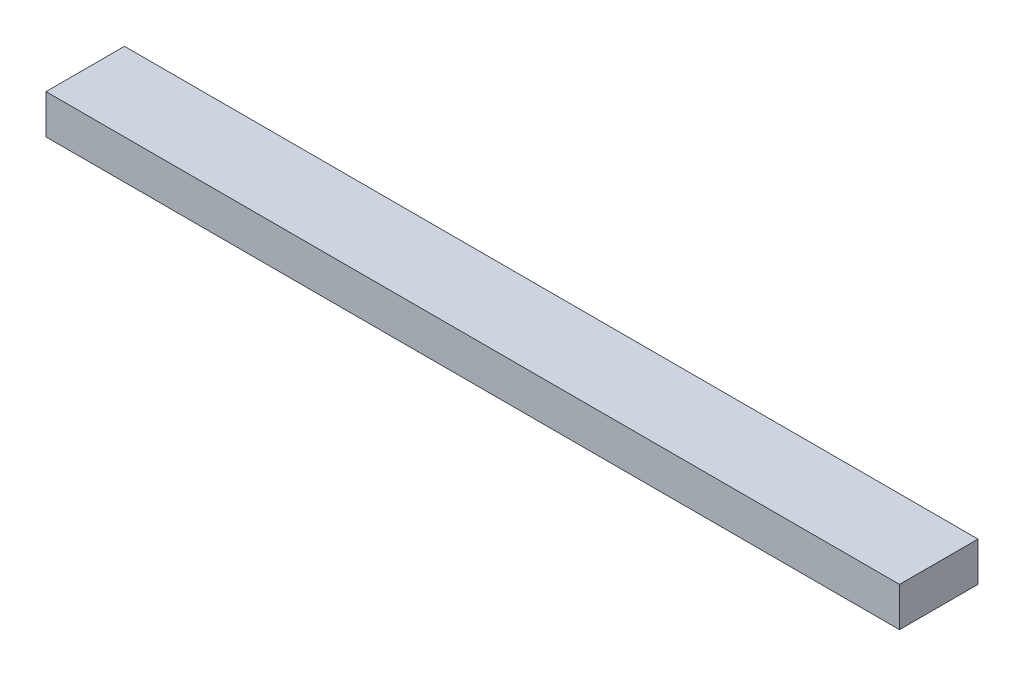
ISO-10303-21;
HEADER;
FILE_DESCRIPTION(('STEP AP214'),'2;1');
FILE_NAME('part.step','',(''),(''),'','','');
FILE_SCHEMA(('AUTOMOTIVE_DESIGN { 1 0 10303 214 1 1 1 1 }'));
ENDSEC;
DATA;
#1=APPLICATION_CONTEXT('core data for automotive mechanical design processes');
#2=APPLICATION_PROTOCOL_DEFINITION('international standard','automotive_design',2000,#1);
#3=PRODUCT_CONTEXT('',#1,'mechanical');
#4=PRODUCT('Part','Part','',(#3));
#5=PRODUCT_RELATED_PRODUCT_CATEGORY('part','',(#4));
#6=PRODUCT_DEFINITION_FORMATION('','',#4);
#7=PRODUCT_DEFINITION_CONTEXT('part definition',#1,'design');
#8=PRODUCT_DEFINITION('design','',#6,#7);
#9=PRODUCT_DEFINITION_SHAPE('','',#8);
#10=(LENGTH_UNIT() NAMED_UNIT(*) SI_UNIT(.MILLI.,.METRE.));
#11=(NAMED_UNIT(*) PLANE_ANGLE_UNIT() SI_UNIT($,.RADIAN.));
#12=(NAMED_UNIT(*) SI_UNIT($,.STERADIAN.) SOLID_ANGLE_UNIT());
#13=UNCERTAINTY_MEASURE_WITH_UNIT(LENGTH_MEASURE(1.E-05),#10,'distance_accuracy_value','');
#14=(GEOMETRIC_REPRESENTATION_CONTEXT(3) GLOBAL_UNCERTAINTY_ASSIGNED_CONTEXT((#13)) GLOBAL_UNIT_ASSIGNED_CONTEXT((#10,
#11,#12)) REPRESENTATION_CONTEXT('',''));
#15=CARTESIAN_POINT('',(0.,0.,0.));
#16=DIRECTION('',(0.,0.,1.));
#17=DIRECTION('',(1.,0.,0.));
#18=AXIS2_PLACEMENT_3D('',#15,#16,#17);
#19=CARTESIAN_POINT('',(276.225,25.4,25.4));
#20=DIRECTION('',(-1.,0.,0.));
#21=DIRECTION('',(0.,0.,1.));
#22=AXIS2_PLACEMENT_3D('',#19,#20,#21);
#23=PLANE('',#22);
#24=DIRECTION('',(0.,0.,-1.));
#25=VECTOR('',#24,1.);
#26=CARTESIAN_POINT('',(276.225,0.,25.4));
#27=LINE('',#26,#25);
#28=CARTESIAN_POINT('',(276.225,0.,25.4));
#29=VERTEX_POINT('',#28);
#30=CARTESIAN_POINT('',(276.225,0.,-25.4));
#31=VERTEX_POINT('',#30);
#32=EDGE_CURVE('E107',#29,#31,#27,.T.);
#33=ORIENTED_EDGE('',*,*,#32,.T.);
#34=DIRECTION('',(0.,-1.,0.));
#35=VECTOR('',#34,1.);
#36=CARTESIAN_POINT('',(276.225,25.4,-25.4));
#37=LINE('',#36,#35);
#38=CARTESIAN_POINT('',(276.225,25.4,-25.4));
#39=VERTEX_POINT('',#38);
#40=EDGE_CURVE('E11',#39,#31,#37,.T.);
#41=ORIENTED_EDGE('',*,*,#40,.F.);
#42=DIRECTION('',(0.,0.,-1.));
#43=VECTOR('',#42,1.);
#44=CARTESIAN_POINT('',(276.225,25.4,25.4));
#45=LINE('',#44,#43);
#46=CARTESIAN_POINT('',(276.225,25.4,25.4));
#47=VERTEX_POINT('',#46);
#48=EDGE_CURVE('E91',#47,#39,#45,.T.);
#49=ORIENTED_EDGE('',*,*,#48,.F.);
#50=DIRECTION('',(0.,-1.,0.));
#51=VECTOR('',#50,1.);
#52=CARTESIAN_POINT('',(276.225,25.4,25.4));
#53=LINE('',#52,#51);
#54=EDGE_CURVE('E103',#47,#29,#53,.T.);
#55=ORIENTED_EDGE('',*,*,#54,.T.);
#56=EDGE_LOOP('',(#33,#41,#49,#55));
#57=FACE_BOUND('',#56,.T.);
#58=ADVANCED_FACE('F39',(#57),#23,.F.);
#59=CARTESIAN_POINT('',(-276.225,25.4,-25.4));
#60=DIRECTION('',(0.,0.,1.));
#61=DIRECTION('',(1.,0.,0.));
#62=AXIS2_PLACEMENT_3D('',#59,#60,#61);
#63=PLANE('',#62);
#64=DIRECTION('',(-1.,0.,0.));
#65=VECTOR('',#64,1.);
#66=CARTESIAN_POINT('',(-276.225,0.,-25.4));
#67=LINE('',#66,#65);
#68=CARTESIAN_POINT('',(-276.225,0.,-25.4));
#69=VERTEX_POINT('',#68);
#70=EDGE_CURVE('E96',#31,#69,#67,.T.);
#71=ORIENTED_EDGE('',*,*,#70,.T.);
#72=DIRECTION('',(0.,-1.,0.));
#73=VECTOR('',#72,1.);
#74=CARTESIAN_POINT('',(-276.225,25.4,-25.4));
#75=LINE('',#74,#73);
#76=CARTESIAN_POINT('',(-276.225,25.4,-25.4));
#77=VERTEX_POINT('',#76);
#78=EDGE_CURVE('E48',#77,#69,#75,.T.);
#79=ORIENTED_EDGE('',*,*,#78,.F.);
#80=DIRECTION('',(-1.,0.,0.));
#81=VECTOR('',#80,1.);
#82=CARTESIAN_POINT('',(-276.225,25.4,-25.4));
#83=LINE('',#82,#81);
#84=EDGE_CURVE('E86',#39,#77,#83,.T.);
#85=ORIENTED_EDGE('',*,*,#84,.F.);
#86=ORIENTED_EDGE('',*,*,#40,.T.);
#87=EDGE_LOOP('',(#71,#79,#85,#86));
#88=FACE_BOUND('',#87,.T.);
#89=ADVANCED_FACE('F95',(#88),#63,.F.);
#90=CARTESIAN_POINT('',(-276.225,25.4,25.4));
#91=DIRECTION('',(1.,0.,0.));
#92=DIRECTION('',(0.,0.,-1.));
#93=AXIS2_PLACEMENT_3D('',#90,#91,#92);
#94=PLANE('',#93);
#95=DIRECTION('',(0.,0.,1.));
#96=VECTOR('',#95,1.);
#97=CARTESIAN_POINT('',(-276.225,0.,25.4));
#98=LINE('',#97,#96);
#99=CARTESIAN_POINT('',(-276.225,0.,25.4));
#100=VERTEX_POINT('',#99);
#101=EDGE_CURVE('E73',#69,#100,#98,.T.);
#102=ORIENTED_EDGE('',*,*,#101,.T.);
#103=DIRECTION('',(0.,-1.,0.));
#104=VECTOR('',#103,1.);
#105=CARTESIAN_POINT('',(-276.225,25.4,25.4));
#106=LINE('',#105,#104);
#107=CARTESIAN_POINT('',(-276.225,25.4,25.4));
#108=VERTEX_POINT('',#107);
#109=EDGE_CURVE('E98',#108,#100,#106,.T.);
#110=ORIENTED_EDGE('',*,*,#109,.F.);
#111=DIRECTION('',(0.,0.,1.));
#112=VECTOR('',#111,1.);
#113=CARTESIAN_POINT('',(-276.225,25.4,25.4));
#114=LINE('',#113,#112);
#115=EDGE_CURVE('E89',#77,#108,#114,.T.);
#116=ORIENTED_EDGE('',*,*,#115,.F.);
#117=ORIENTED_EDGE('',*,*,#78,.T.);
#118=EDGE_LOOP('',(#102,#110,#116,#117));
#119=FACE_BOUND('',#118,.T.);
#120=ADVANCED_FACE('F99',(#119),#94,.F.);
#121=CARTESIAN_POINT('',(-276.225,25.4,25.4));
#122=DIRECTION('',(0.,0.,-1.));
#123=DIRECTION('',(-1.,0.,0.));
#124=AXIS2_PLACEMENT_3D('',#121,#122,#123);
#125=PLANE('',#124);
#126=DIRECTION('',(1.,0.,0.));
#127=VECTOR('',#126,1.);
#128=CARTESIAN_POINT('',(-276.225,0.,25.4));
#129=LINE('',#128,#127);
#130=EDGE_CURVE('E79',#100,#29,#129,.T.);
#131=ORIENTED_EDGE('',*,*,#130,.T.);
#132=ORIENTED_EDGE('',*,*,#54,.F.);
#133=DIRECTION('',(1.,0.,0.));
#134=VECTOR('',#133,1.);
#135=CARTESIAN_POINT('',(-276.225,25.4,25.4));
#136=LINE('',#135,#134);
#137=EDGE_CURVE('E56',#108,#47,#136,.T.);
#138=ORIENTED_EDGE('',*,*,#137,.F.);
#139=ORIENTED_EDGE('',*,*,#109,.T.);
#140=EDGE_LOOP('',(#131,#132,#138,#139));
#141=FACE_BOUND('',#140,.T.);
#142=ADVANCED_FACE('F120',(#141),#125,.F.);
#143=CARTESIAN_POINT('',(0.,25.4,0.));
#144=DIRECTION('',(0.,-1.,0.));
#145=DIRECTION('',(0.,0.,-1.));
#146=AXIS2_PLACEMENT_3D('',#143,#144,#145);
#147=PLANE('',#146);
#148=ORIENTED_EDGE('',*,*,#48,.T.);
#149=ORIENTED_EDGE('',*,*,#84,.T.);
#150=ORIENTED_EDGE('',*,*,#115,.T.);
#151=ORIENTED_EDGE('',*,*,#137,.T.);
#152=EDGE_LOOP('',(#148,#149,#150,#151));
#153=FACE_BOUND('',#152,.T.);
#154=ADVANCED_FACE('F87',(#153),#147,.F.);
#155=CARTESIAN_POINT('',(0.,0.,0.));
#156=DIRECTION('',(0.,-1.,0.));
#157=DIRECTION('',(0.,0.,-1.));
#158=AXIS2_PLACEMENT_3D('',#155,#156,#157);
#159=PLANE('',#158);
#160=ORIENTED_EDGE('',*,*,#32,.F.);
#161=ORIENTED_EDGE('',*,*,#130,.F.);
#162=ORIENTED_EDGE('',*,*,#101,.F.);
#163=ORIENTED_EDGE('',*,*,#70,.F.);
#164=EDGE_LOOP('',(#160,#161,#162,#163));
#165=FACE_BOUND('',#164,.T.);
#166=ADVANCED_FACE('F123',(#165),#159,.T.);
#167=CLOSED_SHELL('',(#58,#89,#120,#142,#154,#166));
#168=MANIFOLD_SOLID_BREP('B2',#167);
#169=ADVANCED_BREP_SHAPE_REPRESENTATION('',(#18,#168),#14);
#170=SHAPE_DEFINITION_REPRESENTATION(#9,#169);
ENDSEC;
END-ISO-10303-21;
